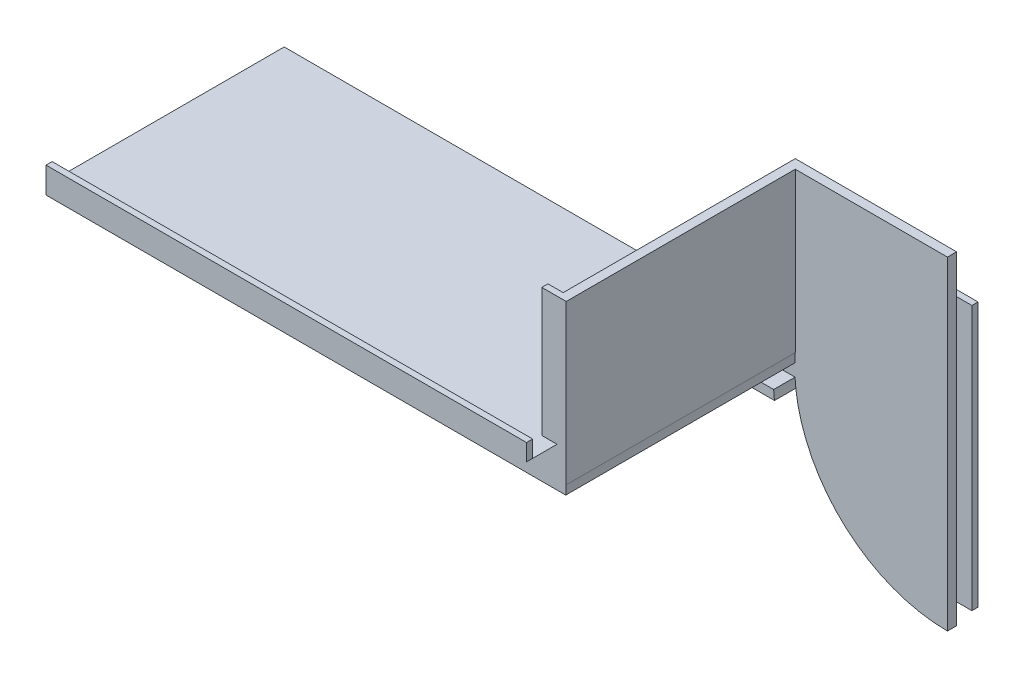
ISO-10303-21;
HEADER;
FILE_DESCRIPTION(('STEP AP214'),'2;1');
FILE_NAME('part.step','',(''),(''),'','','');
FILE_SCHEMA(('AUTOMOTIVE_DESIGN { 1 0 10303 214 1 1 1 1 }'));
ENDSEC;
DATA;
#1=APPLICATION_CONTEXT('core data for automotive mechanical design processes');
#2=APPLICATION_PROTOCOL_DEFINITION('international standard','automotive_design',2000,#1);
#3=PRODUCT_CONTEXT('',#1,'mechanical');
#4=PRODUCT('Part','Part','',(#3));
#5=PRODUCT_RELATED_PRODUCT_CATEGORY('part','',(#4));
#6=PRODUCT_DEFINITION_FORMATION('','',#4);
#7=PRODUCT_DEFINITION_CONTEXT('part definition',#1,'design');
#8=PRODUCT_DEFINITION('design','',#6,#7);
#9=PRODUCT_DEFINITION_SHAPE('','',#8);
#10=(LENGTH_UNIT() NAMED_UNIT(*) SI_UNIT(.MILLI.,.METRE.));
#11=(NAMED_UNIT(*) PLANE_ANGLE_UNIT() SI_UNIT($,.RADIAN.));
#12=(NAMED_UNIT(*) SI_UNIT($,.STERADIAN.) SOLID_ANGLE_UNIT());
#13=UNCERTAINTY_MEASURE_WITH_UNIT(LENGTH_MEASURE(1.E-05),#10,'distance_accuracy_value','');
#14=(GEOMETRIC_REPRESENTATION_CONTEXT(3) GLOBAL_UNCERTAINTY_ASSIGNED_CONTEXT((#13)) GLOBAL_UNIT_ASSIGNED_CONTEXT((#10,
#11,#12)) REPRESENTATION_CONTEXT('',''));
#15=CARTESIAN_POINT('',(0.,0.,0.));
#16=DIRECTION('',(0.,0.,1.));
#17=DIRECTION('',(1.,0.,0.));
#18=AXIS2_PLACEMENT_3D('',#15,#16,#17);
#19=CARTESIAN_POINT('',(-52.8397431775085,341.294854205715,134.));
#20=DIRECTION('',(1.,0.,0.));
#21=DIRECTION('',(0.,0.,-1.));
#22=AXIS2_PLACEMENT_3D('',#19,#20,#21);
#23=PLANE('',#22);
#24=DIRECTION('',(0.,-1.,0.));
#25=VECTOR('',#24,1.);
#26=CARTESIAN_POINT('',(-52.8397431775085,56.,-55.));
#27=LINE('',#26,#25);
#28=CARTESIAN_POINT('',(-52.8397431775085,56.,-55.));
#29=VERTEX_POINT('',#28);
#30=CARTESIAN_POINT('',(-52.8397431775085,14.0000000000001,-55.));
#31=VERTEX_POINT('',#30);
#32=EDGE_CURVE('E60',#29,#31,#27,.T.);
#33=ORIENTED_EDGE('',*,*,#32,.F.);
#34=DIRECTION('',(0.,0.,-1.));
#35=VECTOR('',#34,1.);
#36=CARTESIAN_POINT('',(-52.8397431775085,56.,134.));
#37=LINE('',#36,#35);
#38=CARTESIAN_POINT('',(-52.8397431775085,56.,-131.));
#39=VERTEX_POINT('',#38);
#40=EDGE_CURVE('E374',#29,#39,#37,.T.);
#41=ORIENTED_EDGE('',*,*,#40,.T.);
#42=DIRECTION('',(0.,-1.,0.));
#43=VECTOR('',#42,1.);
#44=CARTESIAN_POINT('',(-52.8397431775085,341.294854205715,-131.));
#45=LINE('',#44,#43);
#46=CARTESIAN_POINT('',(-52.8397431775085,14.0000000000001,-131.));
#47=VERTEX_POINT('',#46);
#48=EDGE_CURVE('E385',#39,#47,#45,.T.);
#49=ORIENTED_EDGE('',*,*,#48,.T.);
#50=DIRECTION('',(0.,0.,1.));
#51=VECTOR('',#50,1.);
#52=CARTESIAN_POINT('',(-52.8397431775085,14.0000000000001,-11.5));
#53=LINE('',#52,#51);
#54=EDGE_CURVE('E401',#47,#31,#53,.T.);
#55=ORIENTED_EDGE('',*,*,#54,.T.);
#56=EDGE_LOOP('',(#33,#41,#49,#55));
#57=FACE_BOUND('',#56,.T.);
#58=ADVANCED_FACE('F44',(#57),#23,.F.);
#59=CARTESIAN_POINT('',(0.,4.,0.));
#60=DIRECTION('',(0.,-1.,0.));
#61=DIRECTION('',(0.,0.,-1.));
#62=AXIS2_PLACEMENT_3D('',#59,#60,#61);
#63=PLANE('',#62);
#64=DIRECTION('',(0.,0.,1.));
#65=VECTOR('',#64,1.);
#66=CARTESIAN_POINT('',(-220.183732216023,4.,-9.99999999999999));
#67=LINE('',#66,#65);
#68=CARTESIAN_POINT('',(-220.183732216023,4.,-131.));
#69=VERTEX_POINT('',#68);
#70=CARTESIAN_POINT('',(-220.183732216023,4.,-55.));
#71=VERTEX_POINT('',#70);
#72=EDGE_CURVE('E399',#69,#71,#67,.T.);
#73=ORIENTED_EDGE('',*,*,#72,.T.);
#74=DIRECTION('',(1.,0.,0.));
#75=VECTOR('',#74,1.);
#76=CARTESIAN_POINT('',(0.,4.,-55.));
#77=LINE('',#76,#75);
#78=CARTESIAN_POINT('',(-62.8397431775084,4.,-55.));
#79=VERTEX_POINT('',#78);
#80=EDGE_CURVE('E280',#71,#79,#77,.T.);
#81=ORIENTED_EDGE('',*,*,#80,.T.);
#82=DIRECTION('',(0.,0.,-1.));
#83=VECTOR('',#82,1.);
#84=CARTESIAN_POINT('',(-62.8397431775084,4.,-131.));
#85=LINE('',#84,#83);
#86=CARTESIAN_POINT('',(-62.8397431775084,4.,-131.));
#87=VERTEX_POINT('',#86);
#88=EDGE_CURVE('E403',#79,#87,#85,.T.);
#89=ORIENTED_EDGE('',*,*,#88,.T.);
#90=DIRECTION('',(-1.,0.,0.));
#91=VECTOR('',#90,1.);
#92=CARTESIAN_POINT('',(-39.7994974842648,4.,-131.));
#93=LINE('',#92,#91);
#94=EDGE_CURVE('E394',#87,#69,#93,.T.);
#95=ORIENTED_EDGE('',*,*,#94,.T.);
#96=EDGE_LOOP('',(#73,#81,#89,#95));
#97=FACE_BOUND('',#96,.T.);
#98=ADVANCED_FACE('F507',(#97),#63,.F.);
#99=CARTESIAN_POINT('',(0.,0.,-131.));
#100=DIRECTION('',(0.,0.,1.));
#101=DIRECTION('',(1.,0.,0.));
#102=AXIS2_PLACEMENT_3D('',#99,#100,#101);
#103=CYLINDRICAL_SURFACE('',#102,50.);
#104=DIRECTION('',(0.,0.,1.));
#105=VECTOR('',#104,1.);
#106=CARTESIAN_POINT('',(-49.9099188538711,-3.,-131.));
#107=LINE('',#106,#105);
#108=CARTESIAN_POINT('',(-49.9099188538711,-3.,-128.));
#109=VERTEX_POINT('',#108);
#110=CARTESIAN_POINT('',(-49.9099188538711,-2.99999999999996,-121.));
#111=VERTEX_POINT('',#110);
#112=EDGE_CURVE('E314',#109,#111,#107,.T.);
#113=ORIENTED_EDGE('',*,*,#112,.T.);
#114=CARTESIAN_POINT('',(0.,0.,-121.));
#115=DIRECTION('',(0.,0.,-1.));
#116=DIRECTION('',(1.,0.,0.));
#117=AXIS2_PLACEMENT_3D('',#114,#115,#116);
#118=CIRCLE('',#117,50.);
#119=CARTESIAN_POINT('',(-49.6386945839634,-6.,-121.));
#120=VERTEX_POINT('',#119);
#121=EDGE_CURVE('E257',#120,#111,#118,.T.);
#122=ORIENTED_EDGE('',*,*,#121,.F.);
#123=DIRECTION('',(0.,0.,1.));
#124=VECTOR('',#123,1.);
#125=CARTESIAN_POINT('',(-49.6386945839634,-6.,-131.));
#126=LINE('',#125,#124);
#127=CARTESIAN_POINT('',(-49.6386945839634,-6.,-128.));
#128=VERTEX_POINT('',#127);
#129=EDGE_CURVE('E303',#120,#128,#126,.F.);
#130=ORIENTED_EDGE('',*,*,#129,.T.);
#131=CARTESIAN_POINT('',(0.,0.,-128.));
#132=DIRECTION('',(0.,0.,-1.));
#133=DIRECTION('',(-1.,0.,0.));
#134=AXIS2_PLACEMENT_3D('',#131,#132,#133);
#135=CIRCLE('',#134,50.);
#136=EDGE_CURVE('E370',#109,#128,#135,.F.);
#137=ORIENTED_EDGE('',*,*,#136,.F.);
#138=EDGE_LOOP('',(#113,#122,#130,#137));
#139=FACE_BOUND('',#138,.T.);
#140=ADVANCED_FACE('F450',(#139),#103,.F.);
#141=DIRECTION('',(0.,0.,1.));
#142=VECTOR('',#141,1.);
#143=CARTESIAN_POINT('',(-49.8397431775085,4.,-131.));
#144=LINE('',#143,#142);
#145=CARTESIAN_POINT('',(-49.8397431775085,4.,-53.));
#146=VERTEX_POINT('',#145);
#147=CARTESIAN_POINT('',(-49.8397431775085,4.,-128.));
#148=VERTEX_POINT('',#147);
#149=EDGE_CURVE('E384',#146,#148,#144,.F.);
#150=ORIENTED_EDGE('',*,*,#149,.F.);
#151=CARTESIAN_POINT('',(0.,0.,-53.));
#152=DIRECTION('',(0.,0.,-1.));
#153=DIRECTION('',(0.,1.,0.));
#154=AXIS2_PLACEMENT_3D('',#151,#152,#153);
#155=CIRCLE('',#154,50.);
#156=CARTESIAN_POINT('',(-49.9899989998,1.,-53.));
#157=VERTEX_POINT('',#156);
#158=EDGE_CURVE('E287',#146,#157,#155,.F.);
#159=ORIENTED_EDGE('',*,*,#158,.T.);
#160=DIRECTION('',(0.,0.,1.));
#161=VECTOR('',#160,1.);
#162=CARTESIAN_POINT('',(-49.9899989998,1.,-131.));
#163=LINE('',#162,#161);
#164=CARTESIAN_POINT('',(-49.9899989998,1.,-128.));
#165=VERTEX_POINT('',#164);
#166=EDGE_CURVE('E311',#157,#165,#163,.F.);
#167=ORIENTED_EDGE('',*,*,#166,.T.);
#168=EDGE_CURVE('E373',#148,#165,#135,.F.);
#169=ORIENTED_EDGE('',*,*,#168,.F.);
#170=EDGE_LOOP('',(#150,#159,#167,#169));
#171=FACE_BOUND('',#170,.T.);
#172=ADVANCED_FACE('F490',(#171),#103,.F.);
#173=CARTESIAN_POINT('',(-49.8397431775085,341.294854205715,131.));
#174=DIRECTION('',(-1.,0.,0.));
#175=DIRECTION('',(0.,0.,1.));
#176=AXIS2_PLACEMENT_3D('',#173,#174,#175);
#177=PLANE('',#176);
#178=DIRECTION('',(0.,0.,1.));
#179=VECTOR('',#178,1.);
#180=CARTESIAN_POINT('',(-49.8397431775085,56.,131.));
#181=LINE('',#180,#179);
#182=CARTESIAN_POINT('',(-49.8397431775085,56.,-128.));
#183=VERTEX_POINT('',#182);
#184=CARTESIAN_POINT('',(-49.8397431775085,56.,-53.));
#185=VERTEX_POINT('',#184);
#186=EDGE_CURVE('E382',#183,#185,#181,.T.);
#187=ORIENTED_EDGE('',*,*,#186,.T.);
#188=DIRECTION('',(0.,-1.,0.));
#189=VECTOR('',#188,1.);
#190=CARTESIAN_POINT('',(-49.8397431775085,341.294854205715,-53.));
#191=LINE('',#190,#189);
#192=EDGE_CURVE('E220',#185,#146,#191,.T.);
#193=ORIENTED_EDGE('',*,*,#192,.T.);
#194=ORIENTED_EDGE('',*,*,#149,.T.);
#195=DIRECTION('',(0.,-1.,0.));
#196=VECTOR('',#195,1.);
#197=CARTESIAN_POINT('',(-49.8397431775085,341.294854205715,-128.));
#198=LINE('',#197,#196);
#199=EDGE_CURVE('E377',#183,#148,#198,.T.);
#200=ORIENTED_EDGE('',*,*,#199,.F.);
#201=EDGE_LOOP('',(#187,#193,#194,#200));
#202=FACE_BOUND('',#201,.T.);
#203=ADVANCED_FACE('F492',(#202),#177,.F.);
#204=CARTESIAN_POINT('',(-220.183732216023,4.,-9.99999999999999));
#205=DIRECTION('',(1.,0.,0.));
#206=DIRECTION('',(0.,0.,-1.));
#207=AXIS2_PLACEMENT_3D('',#204,#205,#206);
#208=PLANE('',#207);
#209=DIRECTION('',(0.,0.,-1.));
#210=VECTOR('',#209,1.);
#211=CARTESIAN_POINT('',(-220.183732216023,1.,-128.));
#212=LINE('',#211,#210);
#213=CARTESIAN_POINT('',(-220.183732216023,1.,-53.));
#214=VERTEX_POINT('',#213);
#215=CARTESIAN_POINT('',(-220.183732216023,1.,-128.));
#216=VERTEX_POINT('',#215);
#217=EDGE_CURVE('E306',#214,#216,#212,.T.);
#218=ORIENTED_EDGE('',*,*,#217,.F.);
#219=DIRECTION('',(0.,-1.,0.));
#220=VECTOR('',#219,1.);
#221=CARTESIAN_POINT('',(-220.183732216023,73.0673728266014,-53.));
#222=LINE('',#221,#220);
#223=CARTESIAN_POINT('',(-220.183732216023,9.5,-53.));
#224=VERTEX_POINT('',#223);
#225=EDGE_CURVE('E285',#224,#214,#222,.T.);
#226=ORIENTED_EDGE('',*,*,#225,.F.);
#227=DIRECTION('',(0.,0.,1.));
#228=VECTOR('',#227,1.);
#229=CARTESIAN_POINT('',(-220.183732216023,9.5,-55.));
#230=LINE('',#229,#228);
#231=CARTESIAN_POINT('',(-220.183732216023,9.5,-55.));
#232=VERTEX_POINT('',#231);
#233=EDGE_CURVE('E277',#232,#224,#230,.T.);
#234=ORIENTED_EDGE('',*,*,#233,.F.);
#235=DIRECTION('',(0.,-1.,0.));
#236=VECTOR('',#235,1.);
#237=CARTESIAN_POINT('',(-220.183732216023,2.5,-55.));
#238=LINE('',#237,#236);
#239=EDGE_CURVE('E264',#232,#71,#238,.T.);
#240=ORIENTED_EDGE('',*,*,#239,.T.);
#241=ORIENTED_EDGE('',*,*,#72,.F.);
#242=DIRECTION('',(0.,-1.,0.));
#243=VECTOR('',#242,1.);
#244=CARTESIAN_POINT('',(-220.183732216023,4.,-131.));
#245=LINE('',#244,#243);
#246=CARTESIAN_POINT('',(-220.183732216023,-6.,-131.));
#247=VERTEX_POINT('',#246);
#248=EDGE_CURVE('E396',#69,#247,#245,.T.);
#249=ORIENTED_EDGE('',*,*,#248,.T.);
#250=DIRECTION('',(0.,0.,-1.));
#251=VECTOR('',#250,1.);
#252=CARTESIAN_POINT('',(-220.183732216023,-6.,-123.));
#253=LINE('',#252,#251);
#254=CARTESIAN_POINT('',(-220.183732216023,-6.,-121.));
#255=VERTEX_POINT('',#254);
#256=EDGE_CURVE('E298',#255,#247,#253,.T.);
#257=ORIENTED_EDGE('',*,*,#256,.F.);
#258=DIRECTION('',(0.,-1.,0.));
#259=VECTOR('',#258,1.);
#260=CARTESIAN_POINT('',(-220.183732216023,-3.,-121.));
#261=LINE('',#260,#259);
#262=CARTESIAN_POINT('',(-220.183732216023,-3.,-121.));
#263=VERTEX_POINT('',#262);
#264=EDGE_CURVE('E251',#263,#255,#261,.T.);
#265=ORIENTED_EDGE('',*,*,#264,.F.);
#266=DIRECTION('',(0.,0.,-1.));
#267=VECTOR('',#266,1.);
#268=CARTESIAN_POINT('',(-220.183732216023,-3.,-128.));
#269=LINE('',#268,#267);
#270=CARTESIAN_POINT('',(-220.183732216023,-3.,-128.));
#271=VERTEX_POINT('',#270);
#272=EDGE_CURVE('E313',#263,#271,#269,.T.);
#273=ORIENTED_EDGE('',*,*,#272,.T.);
#274=DIRECTION('',(0.,1.,0.));
#275=VECTOR('',#274,1.);
#276=CARTESIAN_POINT('',(-220.183732216023,-5.,-128.));
#277=LINE('',#276,#275);
#278=EDGE_CURVE('E391',#271,#216,#277,.T.);
#279=ORIENTED_EDGE('',*,*,#278,.T.);
#280=EDGE_LOOP('',(#218,#226,#234,#240,#241,#249,#257,#265,#273,#279));
#281=FACE_BOUND('',#280,.T.);
#282=ADVANCED_FACE('F459',(#281),#208,.F.);
#283=CARTESIAN_POINT('',(0.,0.,-131.));
#284=DIRECTION('',(0.,0.,-1.));
#285=DIRECTION('',(-1.,0.,0.));
#286=AXIS2_PLACEMENT_3D('',#283,#284,#285);
#287=PLANE('',#286);
#288=CARTESIAN_POINT('',(0.,0.,-131.));
#289=DIRECTION('',(0.,0.,-1.));
#290=DIRECTION('',(-1.,0.,0.));
#291=AXIS2_PLACEMENT_3D('',#288,#289,#290);
#292=CIRCLE('',#291,50.05);
#293=CARTESIAN_POINT('',(0.,-50.05,-131.));
#294=VERTEX_POINT('',#293);
#295=CARTESIAN_POINT('',(-49.6890581516696,-6.,-131.));
#296=VERTEX_POINT('',#295);
#297=EDGE_CURVE('E368',#294,#296,#292,.T.);
#298=ORIENTED_EDGE('',*,*,#297,.T.);
#299=DIRECTION('',(-1.,0.,0.));
#300=VECTOR('',#299,1.);
#301=CARTESIAN_POINT('',(5.00100000000001,-6.,-131.));
#302=LINE('',#301,#300);
#303=EDGE_CURVE('E295',#296,#247,#302,.T.);
#304=ORIENTED_EDGE('',*,*,#303,.T.);
#305=ORIENTED_EDGE('',*,*,#248,.F.);
#306=ORIENTED_EDGE('',*,*,#94,.F.);
#307=DIRECTION('',(-0.707106781186544,-0.707106781186551,0.));
#308=VECTOR('',#307,1.);
#309=CARTESIAN_POINT('',(-52.8397431775085,14.0000000000001,-131.));
#310=LINE('',#309,#308);
#311=EDGE_CURVE('E407',#87,#47,#310,.F.);
#312=ORIENTED_EDGE('',*,*,#311,.T.);
#313=ORIENTED_EDGE('',*,*,#48,.F.);
#314=DIRECTION('',(1.,0.,0.));
#315=VECTOR('',#314,1.);
#316=CARTESIAN_POINT('',(-52.8397431775085,56.,-131.));
#317=LINE('',#316,#315);
#318=CARTESIAN_POINT('',(0.,56.,-131.));
#319=VERTEX_POINT('',#318);
#320=EDGE_CURVE('E376',#39,#319,#317,.T.);
#321=ORIENTED_EDGE('',*,*,#320,.T.);
#322=DIRECTION('',(0.,-1.,0.));
#323=VECTOR('',#322,1.);
#324=CARTESIAN_POINT('',(0.,104.286511517215,-131.));
#325=LINE('',#324,#323);
#326=CARTESIAN_POINT('',(0.,43.2830241784648,-131.));
#327=VERTEX_POINT('',#326);
#328=EDGE_CURVE('E356',#319,#327,#325,.T.);
#329=ORIENTED_EDGE('',*,*,#328,.T.);
#330=DIRECTION('',(1.,0.,0.));
#331=VECTOR('',#330,1.);
#332=CARTESIAN_POINT('',(5.,43.2830241784648,-131.));
#333=LINE('',#332,#331);
#334=CARTESIAN_POINT('',(-3.,43.2830241784648,-131.));
#335=VERTEX_POINT('',#334);
#336=EDGE_CURVE('E326',#335,#327,#333,.T.);
#337=ORIENTED_EDGE('',*,*,#336,.F.);
#338=DIRECTION('',(0.,1.,0.));
#339=VECTOR('',#338,1.);
#340=CARTESIAN_POINT('',(-3.,43.2830241784648,-131.));
#341=LINE('',#340,#339);
#342=CARTESIAN_POINT('',(-3.00000000000001,-43.2830241784648,-131.));
#343=VERTEX_POINT('',#342);
#344=EDGE_CURVE('E338',#343,#335,#341,.T.);
#345=ORIENTED_EDGE('',*,*,#344,.F.);
#346=DIRECTION('',(-1.,0.,0.));
#347=VECTOR('',#346,1.);
#348=CARTESIAN_POINT('',(5.,-43.2830241784648,-131.));
#349=LINE('',#348,#347);
#350=CARTESIAN_POINT('',(0.,-43.2830241784649,-131.));
#351=VERTEX_POINT('',#350);
#352=EDGE_CURVE('E53',#351,#343,#349,.T.);
#353=ORIENTED_EDGE('',*,*,#352,.F.);
#354=EDGE_CURVE('E355',#351,#294,#325,.T.);
#355=ORIENTED_EDGE('',*,*,#354,.T.);
#356=EDGE_LOOP('',(#298,#304,#305,#306,#312,#313,#321,#329,#337,#345,#353,#355));
#357=FACE_BOUND('',#356,.T.);
#358=ADVANCED_FACE('F437',(#357),#287,.T.);
#359=CARTESIAN_POINT('',(220.183732216023,-5.,-128.));
#360=DIRECTION('',(0.,0.,-1.));
#361=DIRECTION('',(-1.,0.,0.));
#362=AXIS2_PLACEMENT_3D('',#359,#360,#361);
#363=PLANE('',#362);
#364=DIRECTION('',(-1.,0.,0.));
#365=VECTOR('',#364,1.);
#366=CARTESIAN_POINT('',(5.,-6.,-128.));
#367=LINE('',#366,#365);
#368=CARTESIAN_POINT('',(-49.6890581516696,-6.,-128.));
#369=VERTEX_POINT('',#368);
#370=EDGE_CURVE('E300',#128,#369,#367,.T.);
#371=ORIENTED_EDGE('',*,*,#370,.T.);
#372=CARTESIAN_POINT('',(0.,0.,-128.));
#373=DIRECTION('',(0.,0.,-1.));
#374=DIRECTION('',(-1.,0.,0.));
#375=AXIS2_PLACEMENT_3D('',#372,#373,#374);
#376=CIRCLE('',#375,50.05);
#377=CARTESIAN_POINT('',(0.,-50.05,-128.));
#378=VERTEX_POINT('',#377);
#379=EDGE_CURVE('E365',#369,#378,#376,.F.);
#380=ORIENTED_EDGE('',*,*,#379,.T.);
#381=DIRECTION('',(0.,1.,0.));
#382=VECTOR('',#381,1.);
#383=CARTESIAN_POINT('',(0.,-5.,-128.));
#384=LINE('',#383,#382);
#385=CARTESIAN_POINT('',(0.,56.,-128.));
#386=VERTEX_POINT('',#385);
#387=EDGE_CURVE('E359',#378,#386,#384,.T.);
#388=ORIENTED_EDGE('',*,*,#387,.T.);
#389=DIRECTION('',(-1.,0.,0.));
#390=VECTOR('',#389,1.);
#391=CARTESIAN_POINT('',(-49.8397431775085,56.,-128.));
#392=LINE('',#391,#390);
#393=EDGE_CURVE('E380',#386,#183,#392,.T.);
#394=ORIENTED_EDGE('',*,*,#393,.T.);
#395=ORIENTED_EDGE('',*,*,#199,.T.);
#396=ORIENTED_EDGE('',*,*,#168,.T.);
#397=DIRECTION('',(-1.,0.,0.));
#398=VECTOR('',#397,1.);
#399=CARTESIAN_POINT('',(5.,1.,-128.));
#400=LINE('',#399,#398);
#401=EDGE_CURVE('E308',#165,#216,#400,.T.);
#402=ORIENTED_EDGE('',*,*,#401,.T.);
#403=ORIENTED_EDGE('',*,*,#278,.F.);
#404=DIRECTION('',(-1.,0.,0.));
#405=VECTOR('',#404,1.);
#406=CARTESIAN_POINT('',(5.00100000000001,-3.,-128.));
#407=LINE('',#406,#405);
#408=EDGE_CURVE('E317',#109,#271,#407,.T.);
#409=ORIENTED_EDGE('',*,*,#408,.F.);
#410=ORIENTED_EDGE('',*,*,#136,.T.);
#411=EDGE_LOOP('',(#371,#380,#388,#394,#395,#396,#402,#403,#409,#410));
#412=FACE_BOUND('',#411,.T.);
#413=ADVANCED_FACE('F446',(#412),#363,.F.);
#414=CARTESIAN_POINT('',(42.9502503121069,56.,234.437492999377));
#415=DIRECTION('',(0.,-1.,0.));
#416=DIRECTION('',(0.,0.,-1.));
#417=AXIS2_PLACEMENT_3D('',#414,#415,#416);
#418=PLANE('',#417);
#419=ORIENTED_EDGE('',*,*,#40,.F.);
#420=DIRECTION('',(1.,0.,0.));
#421=VECTOR('',#420,1.);
#422=CARTESIAN_POINT('',(-57.8397431775085,56.,-55.));
#423=LINE('',#422,#421);
#424=CARTESIAN_POINT('',(-57.8397431775085,56.,-55.));
#425=VERTEX_POINT('',#424);
#426=EDGE_CURVE('E230',#425,#29,#423,.T.);
#427=ORIENTED_EDGE('',*,*,#426,.F.);
#428=DIRECTION('',(0.,0.,-1.));
#429=VECTOR('',#428,1.);
#430=CARTESIAN_POINT('',(-57.8397431775085,56.,-53.));
#431=LINE('',#430,#429);
#432=CARTESIAN_POINT('',(-57.8397431775085,56.,-53.));
#433=VERTEX_POINT('',#432);
#434=EDGE_CURVE('E227',#433,#425,#431,.T.);
#435=ORIENTED_EDGE('',*,*,#434,.F.);
#436=DIRECTION('',(1.,0.,0.));
#437=VECTOR('',#436,1.);
#438=CARTESIAN_POINT('',(42.9502503121069,56.,-53.));
#439=LINE('',#438,#437);
#440=EDGE_CURVE('E213',#433,#185,#439,.T.);
#441=ORIENTED_EDGE('',*,*,#440,.T.);
#442=ORIENTED_EDGE('',*,*,#186,.F.);
#443=ORIENTED_EDGE('',*,*,#393,.F.);
#444=DIRECTION('',(0.,0.,-1.));
#445=VECTOR('',#444,1.);
#446=CARTESIAN_POINT('',(0.,56.,234.437492999377));
#447=LINE('',#446,#445);
#448=EDGE_CURVE('E362',#386,#319,#447,.T.);
#449=ORIENTED_EDGE('',*,*,#448,.T.);
#450=ORIENTED_EDGE('',*,*,#320,.F.);
#451=EDGE_LOOP('',(#419,#427,#435,#441,#442,#443,#449,#450));
#452=FACE_BOUND('',#451,.T.);
#453=ADVANCED_FACE('F228',(#452),#418,.F.);
#454=CARTESIAN_POINT('',(-52.8397431775085,14.0000000000001,134.));
#455=DIRECTION('',(-0.707106781186551,0.707106781186544,0.));
#456=DIRECTION('',(0.,0.,-1.));
#457=AXIS2_PLACEMENT_3D('',#454,#455,#456);
#458=PLANE('',#457);
#459=CARTESIAN_POINT('',(-62.8397431775084,4.,-53.));
#460=VERTEX_POINT('',#459);
#461=EDGE_CURVE('E404',#460,#79,#85,.T.);
#462=ORIENTED_EDGE('',*,*,#461,.F.);
#463=DIRECTION('',(-0.707106781186544,-0.707106781186551,0.));
#464=VECTOR('',#463,1.);
#465=CARTESIAN_POINT('',(-52.8397431775085,14.0000000000001,-53.));
#466=LINE('',#465,#464);
#467=CARTESIAN_POINT('',(-52.8397431775085,14.0000000000001,-53.));
#468=VERTEX_POINT('',#467);
#469=EDGE_CURVE('E224',#460,#468,#466,.F.);
#470=ORIENTED_EDGE('',*,*,#469,.T.);
#471=DIRECTION('',(0.,0.,1.));
#472=VECTOR('',#471,1.);
#473=CARTESIAN_POINT('',(-52.8397431775085,14.0000000000001,-53.));
#474=LINE('',#473,#472);
#475=EDGE_CURVE('E68',#31,#468,#474,.T.);
#476=ORIENTED_EDGE('',*,*,#475,.F.);
#477=ORIENTED_EDGE('',*,*,#54,.F.);
#478=ORIENTED_EDGE('',*,*,#311,.F.);
#479=ORIENTED_EDGE('',*,*,#88,.F.);
#480=EDGE_LOOP('',(#462,#470,#476,#477,#478,#479));
#481=FACE_BOUND('',#480,.T.);
#482=ADVANCED_FACE('F47',(#481),#458,.T.);
#483=CARTESIAN_POINT('',(0.,0.,-272.562777593547));
#484=DIRECTION('',(0.,0.,1.));
#485=DIRECTION('',(1.,0.,0.));
#486=AXIS2_PLACEMENT_3D('',#483,#484,#485);
#487=CYLINDRICAL_SURFACE('',#486,50.05);
#488=DIRECTION('',(0.,0.,1.));
#489=VECTOR('',#488,1.);
#490=CARTESIAN_POINT('',(-49.6890581516696,-6.,-272.562777593547));
#491=LINE('',#490,#489);
#492=EDGE_CURVE('E292',#369,#296,#491,.F.);
#493=ORIENTED_EDGE('',*,*,#492,.T.);
#494=ORIENTED_EDGE('',*,*,#297,.F.);
#495=DIRECTION('',(0.,0.,1.));
#496=VECTOR('',#495,1.);
#497=CARTESIAN_POINT('',(0.,-50.05,-272.562777593547));
#498=LINE('',#497,#496);
#499=EDGE_CURVE('E408',#294,#378,#498,.T.);
#500=ORIENTED_EDGE('',*,*,#499,.T.);
#501=ORIENTED_EDGE('',*,*,#379,.F.);
#502=EDGE_LOOP('',(#493,#494,#500,#501));
#503=FACE_BOUND('',#502,.T.);
#504=ADVANCED_FACE('F441',(#503),#487,.T.);
#505=CARTESIAN_POINT('',(0.,104.286511517215,-131.));
#506=DIRECTION('',(-1.,0.,0.));
#507=DIRECTION('',(0.,0.,1.));
#508=AXIS2_PLACEMENT_3D('',#505,#506,#507);
#509=PLANE('',#508);
#510=ORIENTED_EDGE('',*,*,#387,.F.);
#511=ORIENTED_EDGE('',*,*,#499,.F.);
#512=ORIENTED_EDGE('',*,*,#354,.F.);
#513=EDGE_CURVE('E360',#327,#351,#325,.T.);
#514=ORIENTED_EDGE('',*,*,#513,.F.);
#515=ORIENTED_EDGE('',*,*,#328,.F.);
#516=ORIENTED_EDGE('',*,*,#448,.F.);
#517=EDGE_LOOP('',(#510,#511,#512,#514,#515,#516));
#518=FACE_BOUND('',#517,.T.);
#519=ADVANCED_FACE('F439',(#518),#509,.F.);
#520=CARTESIAN_POINT('',(5.,-43.2830241784648,-133.));
#521=DIRECTION('',(-1.,0.,0.));
#522=DIRECTION('',(0.,0.,1.));
#523=AXIS2_PLACEMENT_3D('',#520,#521,#522);
#524=PLANE('',#523);
#525=DIRECTION('',(0.,-1.,0.));
#526=VECTOR('',#525,1.);
#527=CARTESIAN_POINT('',(5.,-43.2830241784648,-131.));
#528=LINE('',#527,#526);
#529=CARTESIAN_POINT('',(5.,43.2830241784648,-131.));
#530=VERTEX_POINT('',#529);
#531=CARTESIAN_POINT('',(5.,-43.2830241784648,-131.));
#532=VERTEX_POINT('',#531);
#533=EDGE_CURVE('E316',#530,#532,#528,.T.);
#534=ORIENTED_EDGE('',*,*,#533,.T.);
#535=DIRECTION('',(0.,0.,1.));
#536=VECTOR('',#535,1.);
#537=CARTESIAN_POINT('',(5.,-43.2830241784648,-133.));
#538=LINE('',#537,#536);
#539=CARTESIAN_POINT('',(5.,-43.2830241784648,-133.));
#540=VERTEX_POINT('',#539);
#541=EDGE_CURVE('E352',#540,#532,#538,.T.);
#542=ORIENTED_EDGE('',*,*,#541,.F.);
#543=DIRECTION('',(0.,-1.,0.));
#544=VECTOR('',#543,1.);
#545=CARTESIAN_POINT('',(5.,-43.2830241784648,-133.));
#546=LINE('',#545,#544);
#547=CARTESIAN_POINT('',(5.,43.2830241784648,-133.));
#548=VERTEX_POINT('',#547);
#549=EDGE_CURVE('E322',#548,#540,#546,.T.);
#550=ORIENTED_EDGE('',*,*,#549,.F.);
#551=DIRECTION('',(0.,0.,1.));
#552=VECTOR('',#551,1.);
#553=CARTESIAN_POINT('',(5.,43.2830241784648,-133.));
#554=LINE('',#553,#552);
#555=EDGE_CURVE('E332',#548,#530,#554,.T.);
#556=ORIENTED_EDGE('',*,*,#555,.T.);
#557=EDGE_LOOP('',(#534,#542,#550,#556));
#558=FACE_BOUND('',#557,.T.);
#559=ADVANCED_FACE('F431',(#558),#524,.F.);
#560=CARTESIAN_POINT('',(5.,-43.2830241784648,-133.));
#561=DIRECTION('',(0.,1.,0.));
#562=DIRECTION('',(0.,0.,1.));
#563=AXIS2_PLACEMENT_3D('',#560,#561,#562);
#564=PLANE('',#563);
#565=EDGE_CURVE('E335',#532,#351,#349,.T.);
#566=ORIENTED_EDGE('',*,*,#565,.T.);
#567=ORIENTED_EDGE('',*,*,#352,.T.);
#568=DIRECTION('',(0.,0.,1.));
#569=VECTOR('',#568,1.);
#570=CARTESIAN_POINT('',(-3.00000000000001,-43.2830241784648,-133.));
#571=LINE('',#570,#569);
#572=CARTESIAN_POINT('',(-3.00000000000001,-43.2830241784648,-133.));
#573=VERTEX_POINT('',#572);
#574=EDGE_CURVE('E349',#573,#343,#571,.T.);
#575=ORIENTED_EDGE('',*,*,#574,.F.);
#576=DIRECTION('',(-1.,0.,0.));
#577=VECTOR('',#576,1.);
#578=CARTESIAN_POINT('',(5.,-43.2830241784648,-133.));
#579=LINE('',#578,#577);
#580=EDGE_CURVE('E325',#540,#573,#579,.T.);
#581=ORIENTED_EDGE('',*,*,#580,.F.);
#582=ORIENTED_EDGE('',*,*,#541,.T.);
#583=EDGE_LOOP('',(#566,#567,#575,#581,#582));
#584=FACE_BOUND('',#583,.T.);
#585=ADVANCED_FACE('F416',(#584),#564,.F.);
#586=CARTESIAN_POINT('',(-3.,43.2830241784648,-133.));
#587=DIRECTION('',(1.,0.,0.));
#588=DIRECTION('',(0.,1.,0.));
#589=AXIS2_PLACEMENT_3D('',#586,#587,#588);
#590=PLANE('',#589);
#591=ORIENTED_EDGE('',*,*,#344,.T.);
#592=DIRECTION('',(0.,0.,1.));
#593=VECTOR('',#592,1.);
#594=CARTESIAN_POINT('',(-3.,43.2830241784648,-133.));
#595=LINE('',#594,#593);
#596=CARTESIAN_POINT('',(-3.,43.2830241784648,-133.));
#597=VERTEX_POINT('',#596);
#598=EDGE_CURVE('E346',#597,#335,#595,.T.);
#599=ORIENTED_EDGE('',*,*,#598,.F.);
#600=DIRECTION('',(0.,1.,0.));
#601=VECTOR('',#600,1.);
#602=CARTESIAN_POINT('',(-3.,43.2830241784648,-133.));
#603=LINE('',#602,#601);
#604=EDGE_CURVE('E328',#573,#597,#603,.T.);
#605=ORIENTED_EDGE('',*,*,#604,.F.);
#606=ORIENTED_EDGE('',*,*,#574,.T.);
#607=EDGE_LOOP('',(#591,#599,#605,#606));
#608=FACE_BOUND('',#607,.T.);
#609=ADVANCED_FACE('F421',(#608),#590,.F.);
#610=CARTESIAN_POINT('',(5.,43.2830241784648,-133.));
#611=DIRECTION('',(0.,-1.,0.));
#612=DIRECTION('',(0.,0.,-1.));
#613=AXIS2_PLACEMENT_3D('',#610,#611,#612);
#614=PLANE('',#613);
#615=ORIENTED_EDGE('',*,*,#336,.T.);
#616=EDGE_CURVE('E341',#327,#530,#333,.T.);
#617=ORIENTED_EDGE('',*,*,#616,.T.);
#618=ORIENTED_EDGE('',*,*,#555,.F.);
#619=DIRECTION('',(1.,0.,0.));
#620=VECTOR('',#619,1.);
#621=CARTESIAN_POINT('',(5.,43.2830241784648,-133.));
#622=LINE('',#621,#620);
#623=EDGE_CURVE('E330',#597,#548,#622,.T.);
#624=ORIENTED_EDGE('',*,*,#623,.F.);
#625=ORIENTED_EDGE('',*,*,#598,.T.);
#626=EDGE_LOOP('',(#615,#617,#618,#624,#625));
#627=FACE_BOUND('',#626,.T.);
#628=ADVANCED_FACE('F496',(#627),#614,.F.);
#629=CARTESIAN_POINT('',(0.,0.,-133.));
#630=DIRECTION('',(0.,0.,1.));
#631=DIRECTION('',(1.,0.,0.));
#632=AXIS2_PLACEMENT_3D('',#629,#630,#631);
#633=PLANE('',#632);
#634=ORIENTED_EDGE('',*,*,#549,.T.);
#635=ORIENTED_EDGE('',*,*,#580,.T.);
#636=ORIENTED_EDGE('',*,*,#604,.T.);
#637=ORIENTED_EDGE('',*,*,#623,.T.);
#638=EDGE_LOOP('',(#634,#635,#636,#637));
#639=FACE_BOUND('',#638,.T.);
#640=ADVANCED_FACE('F425',(#639),#633,.F.);
#641=CARTESIAN_POINT('',(0.,0.,-131.));
#642=DIRECTION('',(0.,0.,1.));
#643=DIRECTION('',(1.,0.,0.));
#644=AXIS2_PLACEMENT_3D('',#641,#642,#643);
#645=PLANE('',#644);
#646=ORIENTED_EDGE('',*,*,#616,.F.);
#647=ORIENTED_EDGE('',*,*,#513,.T.);
#648=ORIENTED_EDGE('',*,*,#565,.F.);
#649=ORIENTED_EDGE('',*,*,#533,.F.);
#650=EDGE_LOOP('',(#646,#647,#648,#649));
#651=FACE_BOUND('',#650,.T.);
#652=ADVANCED_FACE('F434',(#651),#645,.T.);
#653=CARTESIAN_POINT('',(5.00100000000001,-3.,-128.));
#654=DIRECTION('',(0.,1.,0.));
#655=DIRECTION('',(0.,0.,1.));
#656=AXIS2_PLACEMENT_3D('',#653,#654,#655);
#657=PLANE('',#656);
#658=ORIENTED_EDGE('',*,*,#112,.F.);
#659=ORIENTED_EDGE('',*,*,#408,.T.);
#660=ORIENTED_EDGE('',*,*,#272,.F.);
#661=DIRECTION('',(-1.,0.,0.));
#662=VECTOR('',#661,1.);
#663=CARTESIAN_POINT('',(-49.9099188538711,-2.99999999999998,-121.));
#664=LINE('',#663,#662);
#665=EDGE_CURVE('E260',#111,#263,#664,.T.);
#666=ORIENTED_EDGE('',*,*,#665,.F.);
#667=EDGE_LOOP('',(#658,#659,#660,#666));
#668=FACE_BOUND('',#667,.T.);
#669=ADVANCED_FACE('F597',(#668),#657,.T.);
#670=CARTESIAN_POINT('',(5.,1.,-128.));
#671=DIRECTION('',(0.,1.,0.));
#672=DIRECTION('',(0.,0.,1.));
#673=AXIS2_PLACEMENT_3D('',#670,#671,#672);
#674=PLANE('',#673);
#675=ORIENTED_EDGE('',*,*,#166,.F.);
#676=DIRECTION('',(-1.,0.,0.));
#677=VECTOR('',#676,1.);
#678=CARTESIAN_POINT('',(5.,1.,-53.));
#679=LINE('',#678,#677);
#680=EDGE_CURVE('E13',#157,#214,#679,.T.);
#681=ORIENTED_EDGE('',*,*,#680,.T.);
#682=ORIENTED_EDGE('',*,*,#217,.T.);
#683=ORIENTED_EDGE('',*,*,#401,.F.);
#684=EDGE_LOOP('',(#675,#681,#682,#683));
#685=FACE_BOUND('',#684,.T.);
#686=ADVANCED_FACE('F483',(#685),#674,.F.);
#687=CARTESIAN_POINT('',(5.,-6.,-123.));
#688=DIRECTION('',(0.,1.,0.));
#689=DIRECTION('',(0.,0.,1.));
#690=AXIS2_PLACEMENT_3D('',#687,#688,#689);
#691=PLANE('',#690);
#692=ORIENTED_EDGE('',*,*,#129,.F.);
#693=DIRECTION('',(1.,0.,0.));
#694=VECTOR('',#693,1.);
#695=CARTESIAN_POINT('',(-220.183732216023,-6.,-121.));
#696=LINE('',#695,#694);
#697=EDGE_CURVE('E254',#255,#120,#696,.T.);
#698=ORIENTED_EDGE('',*,*,#697,.F.);
#699=ORIENTED_EDGE('',*,*,#256,.T.);
#700=ORIENTED_EDGE('',*,*,#303,.F.);
#701=ORIENTED_EDGE('',*,*,#492,.F.);
#702=ORIENTED_EDGE('',*,*,#370,.F.);
#703=EDGE_LOOP('',(#692,#698,#699,#700,#701,#702));
#704=FACE_BOUND('',#703,.T.);
#705=ADVANCED_FACE('F444',(#704),#691,.F.);
#706=CARTESIAN_POINT('',(132.816267783977,73.0673728266014,-53.));
#707=DIRECTION('',(0.,0.,-1.));
#708=DIRECTION('',(0.,1.,0.));
#709=AXIS2_PLACEMENT_3D('',#706,#707,#708);
#710=PLANE('',#709);
#711=ORIENTED_EDGE('',*,*,#469,.F.);
#712=DIRECTION('',(0.,1.,0.));
#713=VECTOR('',#712,1.);
#714=CARTESIAN_POINT('',(-62.8397431775084,2.5,-53.));
#715=LINE('',#714,#713);
#716=CARTESIAN_POINT('',(-62.8397431775084,9.5,-53.));
#717=VERTEX_POINT('',#716);
#718=EDGE_CURVE('E263',#460,#717,#715,.T.);
#719=ORIENTED_EDGE('',*,*,#718,.T.);
#720=DIRECTION('',(-1.,0.,0.));
#721=VECTOR('',#720,1.);
#722=CARTESIAN_POINT('',(-220.183732216023,9.5,-53.));
#723=LINE('',#722,#721);
#724=EDGE_CURVE('E268',#717,#224,#723,.T.);
#725=ORIENTED_EDGE('',*,*,#724,.T.);
#726=ORIENTED_EDGE('',*,*,#225,.T.);
#727=ORIENTED_EDGE('',*,*,#680,.F.);
#728=ORIENTED_EDGE('',*,*,#158,.F.);
#729=ORIENTED_EDGE('',*,*,#192,.F.);
#730=ORIENTED_EDGE('',*,*,#440,.F.);
#731=DIRECTION('',(0.,1.,0.));
#732=VECTOR('',#731,1.);
#733=CARTESIAN_POINT('',(-57.8397431775085,56.,-53.));
#734=LINE('',#733,#732);
#735=CARTESIAN_POINT('',(-57.8397431775085,14.0000000000001,-53.));
#736=VERTEX_POINT('',#735);
#737=EDGE_CURVE('E218',#736,#433,#734,.T.);
#738=ORIENTED_EDGE('',*,*,#737,.F.);
#739=DIRECTION('',(1.,0.,0.));
#740=VECTOR('',#739,1.);
#741=CARTESIAN_POINT('',(-57.8397431775085,14.0000000000001,-53.));
#742=LINE('',#741,#740);
#743=EDGE_CURVE('E244',#736,#468,#742,.T.);
#744=ORIENTED_EDGE('',*,*,#743,.T.);
#745=EDGE_LOOP('',(#711,#719,#725,#726,#727,#728,#729,#730,#738,#744));
#746=FACE_BOUND('',#745,.T.);
#747=ADVANCED_FACE('F215',(#746),#710,.F.);
#748=CARTESIAN_POINT('',(0.,0.,-55.));
#749=DIRECTION('',(0.,0.,-1.));
#750=DIRECTION('',(-1.,0.,0.));
#751=AXIS2_PLACEMENT_3D('',#748,#749,#750);
#752=PLANE('',#751);
#753=ORIENTED_EDGE('',*,*,#80,.F.);
#754=ORIENTED_EDGE('',*,*,#239,.F.);
#755=DIRECTION('',(-1.,0.,0.));
#756=VECTOR('',#755,1.);
#757=CARTESIAN_POINT('',(-220.183732216023,9.5,-55.));
#758=LINE('',#757,#756);
#759=CARTESIAN_POINT('',(-62.8397431775084,9.5,-55.));
#760=VERTEX_POINT('',#759);
#761=EDGE_CURVE('E270',#760,#232,#758,.T.);
#762=ORIENTED_EDGE('',*,*,#761,.F.);
#763=DIRECTION('',(0.,1.,0.));
#764=VECTOR('',#763,1.);
#765=CARTESIAN_POINT('',(-62.8397431775084,2.5,-55.));
#766=LINE('',#765,#764);
#767=EDGE_CURVE('E267',#79,#760,#766,.T.);
#768=ORIENTED_EDGE('',*,*,#767,.F.);
#769=EDGE_LOOP('',(#753,#754,#762,#768));
#770=FACE_BOUND('',#769,.T.);
#771=ADVANCED_FACE('F614',(#770),#752,.T.);
#772=CARTESIAN_POINT('',(-62.8397431775084,2.5,-55.));
#773=DIRECTION('',(1.,0.,0.));
#774=DIRECTION('',(0.,0.,-1.));
#775=AXIS2_PLACEMENT_3D('',#772,#773,#774);
#776=PLANE('',#775);
#777=ORIENTED_EDGE('',*,*,#461,.T.);
#778=ORIENTED_EDGE('',*,*,#767,.T.);
#779=DIRECTION('',(0.,0.,1.));
#780=VECTOR('',#779,1.);
#781=CARTESIAN_POINT('',(-62.8397431775084,9.5,-55.));
#782=LINE('',#781,#780);
#783=EDGE_CURVE('E273',#760,#717,#782,.T.);
#784=ORIENTED_EDGE('',*,*,#783,.T.);
#785=ORIENTED_EDGE('',*,*,#718,.F.);
#786=EDGE_LOOP('',(#777,#778,#784,#785));
#787=FACE_BOUND('',#786,.T.);
#788=ADVANCED_FACE('F475',(#787),#776,.T.);
#789=CARTESIAN_POINT('',(-220.183732216023,9.5,-55.));
#790=DIRECTION('',(0.,1.,0.));
#791=DIRECTION('',(0.,0.,1.));
#792=AXIS2_PLACEMENT_3D('',#789,#790,#791);
#793=PLANE('',#792);
#794=ORIENTED_EDGE('',*,*,#724,.F.);
#795=ORIENTED_EDGE('',*,*,#783,.F.);
#796=ORIENTED_EDGE('',*,*,#761,.T.);
#797=ORIENTED_EDGE('',*,*,#233,.T.);
#798=EDGE_LOOP('',(#794,#795,#796,#797));
#799=FACE_BOUND('',#798,.T.);
#800=ADVANCED_FACE('F480',(#799),#793,.T.);
#801=CARTESIAN_POINT('',(0.,0.,-121.));
#802=DIRECTION('',(0.,0.,1.));
#803=DIRECTION('',(1.,0.,0.));
#804=AXIS2_PLACEMENT_3D('',#801,#802,#803);
#805=PLANE('',#804);
#806=ORIENTED_EDGE('',*,*,#264,.T.);
#807=ORIENTED_EDGE('',*,*,#697,.T.);
#808=ORIENTED_EDGE('',*,*,#121,.T.);
#809=ORIENTED_EDGE('',*,*,#665,.T.);
#810=EDGE_LOOP('',(#806,#807,#808,#809));
#811=FACE_BOUND('',#810,.T.);
#812=ADVANCED_FACE('F454',(#811),#805,.T.);
#813=CARTESIAN_POINT('',(-57.8397431775085,56.,-55.));
#814=DIRECTION('',(0.,0.,1.));
#815=DIRECTION('',(1.,0.,0.));
#816=AXIS2_PLACEMENT_3D('',#813,#814,#815);
#817=PLANE('',#816);
#818=ORIENTED_EDGE('',*,*,#32,.T.);
#819=DIRECTION('',(1.,0.,0.));
#820=VECTOR('',#819,1.);
#821=CARTESIAN_POINT('',(-57.8397431775085,14.0000000000001,-55.));
#822=LINE('',#821,#820);
#823=CARTESIAN_POINT('',(-57.8397431775085,14.0000000000001,-55.));
#824=VERTEX_POINT('',#823);
#825=EDGE_CURVE('E247',#824,#31,#822,.T.);
#826=ORIENTED_EDGE('',*,*,#825,.F.);
#827=DIRECTION('',(0.,-1.,0.));
#828=VECTOR('',#827,1.);
#829=CARTESIAN_POINT('',(-57.8397431775085,56.,-55.));
#830=LINE('',#829,#828);
#831=EDGE_CURVE('E233',#425,#824,#830,.T.);
#832=ORIENTED_EDGE('',*,*,#831,.F.);
#833=ORIENTED_EDGE('',*,*,#426,.T.);
#834=EDGE_LOOP('',(#818,#826,#832,#833));
#835=FACE_BOUND('',#834,.T.);
#836=ADVANCED_FACE('F469',(#835),#817,.F.);
#837=CARTESIAN_POINT('',(-57.8397431775085,14.0000000000001,-53.));
#838=DIRECTION('',(0.,1.,0.));
#839=DIRECTION('',(0.,0.,1.));
#840=AXIS2_PLACEMENT_3D('',#837,#838,#839);
#841=PLANE('',#840);
#842=ORIENTED_EDGE('',*,*,#475,.T.);
#843=ORIENTED_EDGE('',*,*,#743,.F.);
#844=DIRECTION('',(0.,0.,1.));
#845=VECTOR('',#844,1.);
#846=CARTESIAN_POINT('',(-57.8397431775085,14.0000000000001,-53.));
#847=LINE('',#846,#845);
#848=EDGE_CURVE('E237',#824,#736,#847,.T.);
#849=ORIENTED_EDGE('',*,*,#848,.F.);
#850=ORIENTED_EDGE('',*,*,#825,.T.);
#851=EDGE_LOOP('',(#842,#843,#849,#850));
#852=FACE_BOUND('',#851,.T.);
#853=ADVANCED_FACE('F471',(#852),#841,.F.);
#854=CARTESIAN_POINT('',(-57.8397431775085,0.,0.));
#855=DIRECTION('',(1.,0.,0.));
#856=DIRECTION('',(0.,0.,-1.));
#857=AXIS2_PLACEMENT_3D('',#854,#855,#856);
#858=PLANE('',#857);
#859=ORIENTED_EDGE('',*,*,#737,.T.);
#860=ORIENTED_EDGE('',*,*,#434,.T.);
#861=ORIENTED_EDGE('',*,*,#831,.T.);
#862=ORIENTED_EDGE('',*,*,#848,.T.);
#863=EDGE_LOOP('',(#859,#860,#861,#862));
#864=FACE_BOUND('',#863,.T.);
#865=ADVANCED_FACE('F235',(#864),#858,.F.);
#866=CLOSED_SHELL('',(#58,#98,#140,#172,#203,#282,#358,#413,#453,#482,#504,#519,#559,#585,#609,
#628,#640,#652,#669,#686,#705,#747,#771,#788,#800,#812,#836,#853,#865));
#867=MANIFOLD_SOLID_BREP('B2',#866);
#868=ADVANCED_BREP_SHAPE_REPRESENTATION('',(#18,#867),#14);
#869=SHAPE_DEFINITION_REPRESENTATION(#9,#868);
ENDSEC;
END-ISO-10303-21;
